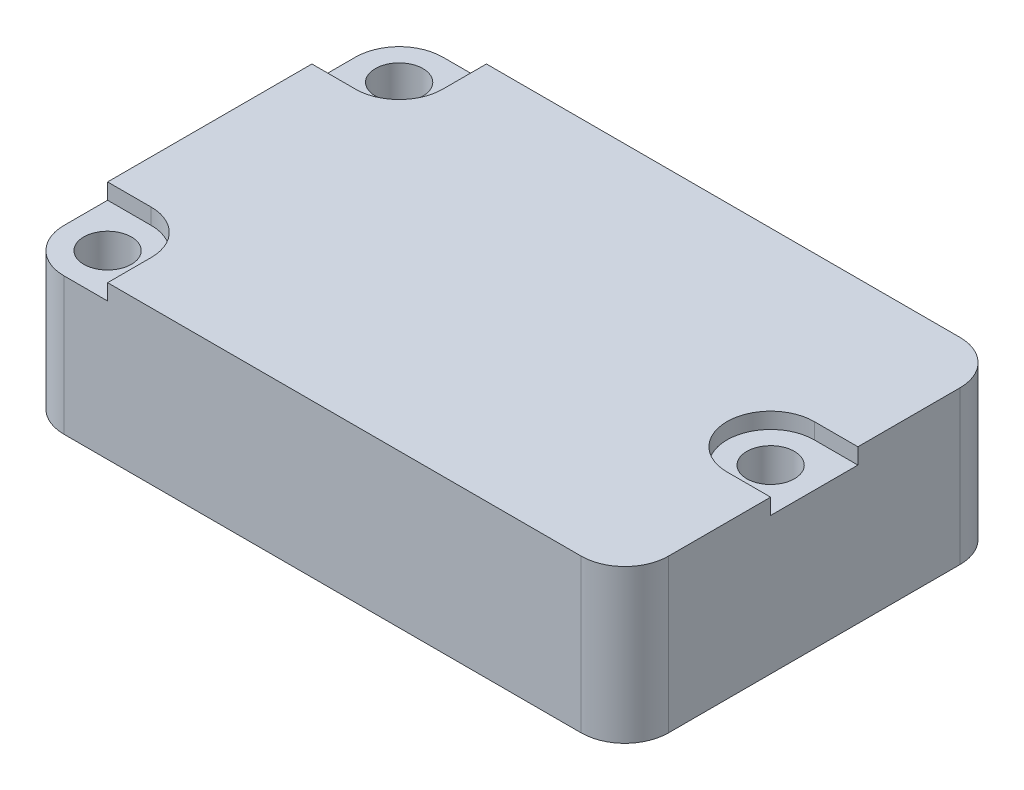
ISO-10303-21;
HEADER;
FILE_DESCRIPTION(('STEP AP214'),'2;1');
FILE_NAME('part.step','',(''),(''),'','','');
FILE_SCHEMA(('AUTOMOTIVE_DESIGN { 1 0 10303 214 1 1 1 1 }'));
ENDSEC;
DATA;
#1=APPLICATION_CONTEXT('core data for automotive mechanical design processes');
#2=APPLICATION_PROTOCOL_DEFINITION('international standard','automotive_design',2000,#1);
#3=PRODUCT_CONTEXT('',#1,'mechanical');
#4=PRODUCT('Part','Part','',(#3));
#5=PRODUCT_RELATED_PRODUCT_CATEGORY('part','',(#4));
#6=PRODUCT_DEFINITION_FORMATION('','',#4);
#7=PRODUCT_DEFINITION_CONTEXT('part definition',#1,'design');
#8=PRODUCT_DEFINITION('design','',#6,#7);
#9=PRODUCT_DEFINITION_SHAPE('','',#8);
#10=(LENGTH_UNIT() NAMED_UNIT(*) SI_UNIT(.MILLI.,.METRE.));
#11=(NAMED_UNIT(*) PLANE_ANGLE_UNIT() SI_UNIT($,.RADIAN.));
#12=(NAMED_UNIT(*) SI_UNIT($,.STERADIAN.) SOLID_ANGLE_UNIT());
#13=UNCERTAINTY_MEASURE_WITH_UNIT(LENGTH_MEASURE(1.E-05),#10,'distance_accuracy_value','');
#14=(GEOMETRIC_REPRESENTATION_CONTEXT(3) GLOBAL_UNCERTAINTY_ASSIGNED_CONTEXT((#13)) GLOBAL_UNIT_ASSIGNED_CONTEXT((#10,
#11,#12)) REPRESENTATION_CONTEXT('',''));
#15=CARTESIAN_POINT('',(0.,0.,0.));
#16=DIRECTION('',(0.,0.,1.));
#17=DIRECTION('',(1.,0.,0.));
#18=AXIS2_PLACEMENT_3D('',#15,#16,#17);
#19=CARTESIAN_POINT('',(35.35,9.65,2.75));
#20=DIRECTION('',(0.,-1.,0.));
#21=DIRECTION('',(0.,0.,-1.));
#22=AXIS2_PLACEMENT_3D('',#19,#20,#21);
#23=PLANE('',#22);
#24=DIRECTION('',(0.,0.,1.));
#25=VECTOR('',#24,1.);
#26=CARTESIAN_POINT('',(0.,9.65,2.75000000000002));
#27=LINE('',#26,#25);
#28=CARTESIAN_POINT('',(0.,9.65,5.5));
#29=VERTEX_POINT('',#28);
#30=CARTESIAN_POINT('',(0.,9.65,18.376));
#31=VERTEX_POINT('',#30);
#32=EDGE_CURVE('E343',#29,#31,#27,.T.);
#33=ORIENTED_EDGE('',*,*,#32,.T.);
#34=DIRECTION('',(-1.,0.,0.));
#35=VECTOR('',#34,1.);
#36=CARTESIAN_POINT('',(0.,9.65,18.376));
#37=LINE('',#36,#35);
#38=CARTESIAN_POINT('',(2.75,9.65,18.376));
#39=VERTEX_POINT('',#38);
#40=EDGE_CURVE('E239',#39,#31,#37,.T.);
#41=ORIENTED_EDGE('',*,*,#40,.F.);
#42=CARTESIAN_POINT('',(2.75,9.65,21.126));
#43=DIRECTION('',(0.,1.,0.));
#44=DIRECTION('',(0.,0.,1.));
#45=AXIS2_PLACEMENT_3D('',#42,#43,#44);
#46=CIRCLE('',#45,2.75);
#47=CARTESIAN_POINT('',(5.5,9.65,21.126));
#48=VERTEX_POINT('',#47);
#49=EDGE_CURVE('E254',#48,#39,#46,.T.);
#50=ORIENTED_EDGE('',*,*,#49,.F.);
#51=DIRECTION('',(0.,0.,1.));
#52=VECTOR('',#51,1.);
#53=CARTESIAN_POINT('',(5.5,9.65,0.));
#54=LINE('',#53,#52);
#55=CARTESIAN_POINT('',(5.5,9.65,23.876));
#56=VERTEX_POINT('',#55);
#57=EDGE_CURVE('E251',#48,#56,#54,.T.);
#58=ORIENTED_EDGE('',*,*,#57,.T.);
#59=DIRECTION('',(1.,0.,0.));
#60=VECTOR('',#59,1.);
#61=CARTESIAN_POINT('',(2.75000000000002,9.65,23.876));
#62=LINE('',#61,#60);
#63=CARTESIAN_POINT('',(35.35,9.65,23.876));
#64=VERTEX_POINT('',#63);
#65=EDGE_CURVE('E346',#56,#64,#62,.T.);
#66=ORIENTED_EDGE('',*,*,#65,.T.);
#67=CARTESIAN_POINT('',(35.35,9.65,21.126));
#68=DIRECTION('',(0.,1.,0.));
#69=DIRECTION('',(0.,0.,1.));
#70=AXIS2_PLACEMENT_3D('',#67,#68,#69);
#71=CIRCLE('',#70,2.75);
#72=CARTESIAN_POINT('',(38.1,9.65,21.126));
#73=VERTEX_POINT('',#72);
#74=EDGE_CURVE('E348',#64,#73,#71,.T.);
#75=ORIENTED_EDGE('',*,*,#74,.T.);
#76=DIRECTION('',(0.,0.,-1.));
#77=VECTOR('',#76,1.);
#78=CARTESIAN_POINT('',(38.1,9.65,2.75000000000002));
#79=LINE('',#78,#77);
#80=CARTESIAN_POINT('',(38.1,9.65,14.688));
#81=VERTEX_POINT('',#80);
#82=EDGE_CURVE('E351',#73,#81,#79,.T.);
#83=ORIENTED_EDGE('',*,*,#82,.T.);
#84=DIRECTION('',(1.,0.,0.));
#85=VECTOR('',#84,1.);
#86=CARTESIAN_POINT('',(0.,9.65,14.688));
#87=LINE('',#86,#85);
#88=CARTESIAN_POINT('',(35.35,9.65,14.688));
#89=VERTEX_POINT('',#88);
#90=EDGE_CURVE('E311',#89,#81,#87,.T.);
#91=ORIENTED_EDGE('',*,*,#90,.F.);
#92=CARTESIAN_POINT('',(35.35,9.65,11.938));
#93=DIRECTION('',(0.,1.,0.));
#94=DIRECTION('',(0.,0.,1.));
#95=AXIS2_PLACEMENT_3D('',#92,#93,#94);
#96=CIRCLE('',#95,2.75);
#97=CARTESIAN_POINT('',(35.35,9.65,9.188));
#98=VERTEX_POINT('',#97);
#99=EDGE_CURVE('E231',#98,#89,#96,.T.);
#100=ORIENTED_EDGE('',*,*,#99,.F.);
#101=DIRECTION('',(1.,0.,0.));
#102=VECTOR('',#101,1.);
#103=CARTESIAN_POINT('',(0.,9.65,9.188));
#104=LINE('',#103,#102);
#105=CARTESIAN_POINT('',(38.1,9.65,9.188));
#106=VERTEX_POINT('',#105);
#107=EDGE_CURVE('E301',#98,#106,#104,.T.);
#108=ORIENTED_EDGE('',*,*,#107,.T.);
#109=CARTESIAN_POINT('',(38.1,9.65,2.75000000000002));
#110=VERTEX_POINT('',#109);
#111=EDGE_CURVE('E350',#106,#110,#79,.T.);
#112=ORIENTED_EDGE('',*,*,#111,.T.);
#113=CARTESIAN_POINT('',(35.35,9.65,2.75));
#114=DIRECTION('',(0.,1.,0.));
#115=DIRECTION('',(0.,0.,-1.));
#116=AXIS2_PLACEMENT_3D('',#113,#114,#115);
#117=CIRCLE('',#116,2.75);
#118=CARTESIAN_POINT('',(35.35,9.65,0.));
#119=VERTEX_POINT('',#118);
#120=EDGE_CURVE('E336',#110,#119,#117,.T.);
#121=ORIENTED_EDGE('',*,*,#120,.T.);
#122=DIRECTION('',(-1.,0.,0.));
#123=VECTOR('',#122,1.);
#124=CARTESIAN_POINT('',(2.75000000000002,9.65,0.));
#125=LINE('',#124,#123);
#126=CARTESIAN_POINT('',(5.5,9.65,0.));
#127=VERTEX_POINT('',#126);
#128=EDGE_CURVE('E339',#119,#127,#125,.T.);
#129=ORIENTED_EDGE('',*,*,#128,.T.);
#130=DIRECTION('',(0.,0.,-1.));
#131=VECTOR('',#130,1.);
#132=CARTESIAN_POINT('',(5.5,9.65,0.));
#133=LINE('',#132,#131);
#134=CARTESIAN_POINT('',(5.5,9.65,2.75));
#135=VERTEX_POINT('',#134);
#136=EDGE_CURVE('E285',#135,#127,#133,.T.);
#137=ORIENTED_EDGE('',*,*,#136,.F.);
#138=CARTESIAN_POINT('',(2.75,9.65,2.75));
#139=DIRECTION('',(0.,1.,0.));
#140=DIRECTION('',(0.,0.,1.));
#141=AXIS2_PLACEMENT_3D('',#138,#139,#140);
#142=CIRCLE('',#141,2.75);
#143=CARTESIAN_POINT('',(2.75,9.65,5.5));
#144=VERTEX_POINT('',#143);
#145=EDGE_CURVE('E282',#144,#135,#142,.T.);
#146=ORIENTED_EDGE('',*,*,#145,.F.);
#147=DIRECTION('',(-1.,0.,0.));
#148=VECTOR('',#147,1.);
#149=CARTESIAN_POINT('',(0.,9.65,5.5));
#150=LINE('',#149,#148);
#151=EDGE_CURVE('E272',#144,#29,#150,.T.);
#152=ORIENTED_EDGE('',*,*,#151,.T.);
#153=EDGE_LOOP('',(#33,#41,#50,#58,#66,#75,#83,#91,#100,#108,#112,#121,#129,#137,#146,#152));
#154=FACE_BOUND('',#153,.T.);
#155=ADVANCED_FACE('F36',(#154),#23,.F.);
#156=CARTESIAN_POINT('',(2.75,9.65,2.75));
#157=DIRECTION('',(0.,-1.,0.));
#158=DIRECTION('',(0.,0.,-1.));
#159=AXIS2_PLACEMENT_3D('',#156,#157,#158);
#160=CYLINDRICAL_SURFACE('',#159,2.75);
#161=CARTESIAN_POINT('',(2.75,8.65,2.75));
#162=DIRECTION('',(0.,1.,0.));
#163=DIRECTION('',(0.,0.,1.));
#164=AXIS2_PLACEMENT_3D('',#161,#162,#163);
#165=CIRCLE('',#164,2.75);
#166=CARTESIAN_POINT('',(2.75,8.65,0.));
#167=VERTEX_POINT('',#166);
#168=CARTESIAN_POINT('',(0.,8.65,2.75000000000002));
#169=VERTEX_POINT('',#168);
#170=EDGE_CURVE('E61',#167,#169,#165,.T.);
#171=ORIENTED_EDGE('',*,*,#170,.F.);
#172=DIRECTION('',(0.,-1.,0.));
#173=VECTOR('',#172,1.);
#174=CARTESIAN_POINT('',(2.75000000000002,9.65,0.));
#175=LINE('',#174,#173);
#176=CARTESIAN_POINT('',(2.75000000000002,0.,0.));
#177=VERTEX_POINT('',#176);
#178=EDGE_CURVE('E45',#167,#177,#175,.T.);
#179=ORIENTED_EDGE('',*,*,#178,.T.);
#180=CARTESIAN_POINT('',(2.75,0.,2.75));
#181=DIRECTION('',(0.,1.,0.));
#182=DIRECTION('',(0.,0.,1.));
#183=AXIS2_PLACEMENT_3D('',#180,#181,#182);
#184=CIRCLE('',#183,2.75);
#185=CARTESIAN_POINT('',(0.,0.,2.75000000000002));
#186=VERTEX_POINT('',#185);
#187=EDGE_CURVE('E360',#177,#186,#184,.T.);
#188=ORIENTED_EDGE('',*,*,#187,.T.);
#189=DIRECTION('',(0.,-1.,0.));
#190=VECTOR('',#189,1.);
#191=CARTESIAN_POINT('',(0.,9.65,2.75000000000002));
#192=LINE('',#191,#190);
#193=EDGE_CURVE('E388',#169,#186,#192,.T.);
#194=ORIENTED_EDGE('',*,*,#193,.F.);
#195=EDGE_LOOP('',(#171,#179,#188,#194));
#196=FACE_BOUND('',#195,.T.);
#197=ADVANCED_FACE('F418',(#196),#160,.T.);
#198=CARTESIAN_POINT('',(0.,9.65,2.75000000000002));
#199=DIRECTION('',(1.,0.,0.));
#200=DIRECTION('',(0.,0.,-1.));
#201=AXIS2_PLACEMENT_3D('',#198,#199,#200);
#202=PLANE('',#201);
#203=DIRECTION('',(0.,0.,-1.));
#204=VECTOR('',#203,1.);
#205=CARTESIAN_POINT('',(0.,8.,5.5));
#206=LINE('',#205,#204);
#207=CARTESIAN_POINT('',(0.,8.,18.376));
#208=VERTEX_POINT('',#207);
#209=CARTESIAN_POINT('',(0.,8.,5.5));
#210=VERTEX_POINT('',#209);
#211=EDGE_CURVE('E222',#208,#210,#206,.T.);
#212=ORIENTED_EDGE('',*,*,#211,.F.);
#213=DIRECTION('',(0.,1.,0.));
#214=VECTOR('',#213,1.);
#215=CARTESIAN_POINT('',(0.,8.,18.376));
#216=LINE('',#215,#214);
#217=CARTESIAN_POINT('',(0.,0.,18.376));
#218=VERTEX_POINT('',#217);
#219=EDGE_CURVE('E207',#218,#208,#216,.T.);
#220=ORIENTED_EDGE('',*,*,#219,.F.);
#221=DIRECTION('',(0.,0.,1.));
#222=VECTOR('',#221,1.);
#223=CARTESIAN_POINT('',(0.,0.,2.75000000000002));
#224=LINE('',#223,#222);
#225=CARTESIAN_POINT('',(0.,0.,21.126));
#226=VERTEX_POINT('',#225);
#227=EDGE_CURVE('E363',#218,#226,#224,.T.);
#228=ORIENTED_EDGE('',*,*,#227,.T.);
#229=DIRECTION('',(0.,-1.,0.));
#230=VECTOR('',#229,1.);
#231=CARTESIAN_POINT('',(0.,9.65,21.126));
#232=LINE('',#231,#230);
#233=CARTESIAN_POINT('',(0.,8.65,21.126));
#234=VERTEX_POINT('',#233);
#235=EDGE_CURVE('E385',#234,#226,#232,.T.);
#236=ORIENTED_EDGE('',*,*,#235,.F.);
#237=DIRECTION('',(0.,0.,1.));
#238=VECTOR('',#237,1.);
#239=CARTESIAN_POINT('',(0.,8.65,0.));
#240=LINE('',#239,#238);
#241=CARTESIAN_POINT('',(0.,8.65,18.376));
#242=VERTEX_POINT('',#241);
#243=EDGE_CURVE('E236',#242,#234,#240,.T.);
#244=ORIENTED_EDGE('',*,*,#243,.F.);
#245=DIRECTION('',(0.,1.,0.));
#246=VECTOR('',#245,1.);
#247=CARTESIAN_POINT('',(0.,8.65,18.376));
#248=LINE('',#247,#246);
#249=EDGE_CURVE('E259',#242,#31,#248,.T.);
#250=ORIENTED_EDGE('',*,*,#249,.T.);
#251=ORIENTED_EDGE('',*,*,#32,.F.);
#252=DIRECTION('',(0.,1.,0.));
#253=VECTOR('',#252,1.);
#254=CARTESIAN_POINT('',(0.,8.65,5.5));
#255=LINE('',#254,#253);
#256=CARTESIAN_POINT('',(0.,8.65,5.5));
#257=VERTEX_POINT('',#256);
#258=EDGE_CURVE('E291',#257,#29,#255,.T.);
#259=ORIENTED_EDGE('',*,*,#258,.F.);
#260=DIRECTION('',(0.,0.,-1.));
#261=VECTOR('',#260,1.);
#262=CARTESIAN_POINT('',(0.,8.65,0.));
#263=LINE('',#262,#261);
#264=EDGE_CURVE('E277',#257,#169,#263,.T.);
#265=ORIENTED_EDGE('',*,*,#264,.T.);
#266=ORIENTED_EDGE('',*,*,#193,.T.);
#267=CARTESIAN_POINT('',(0.,0.,5.5));
#268=VERTEX_POINT('',#267);
#269=EDGE_CURVE('E364',#186,#268,#224,.T.);
#270=ORIENTED_EDGE('',*,*,#269,.T.);
#271=DIRECTION('',(0.,-1.,0.));
#272=VECTOR('',#271,1.);
#273=CARTESIAN_POINT('',(0.,8.,5.5));
#274=LINE('',#273,#272);
#275=EDGE_CURVE('E220',#210,#268,#274,.T.);
#276=ORIENTED_EDGE('',*,*,#275,.F.);
#277=EDGE_LOOP('',(#212,#220,#228,#236,#244,#250,#251,#259,#265,#266,#270,#276));
#278=FACE_BOUND('',#277,.T.);
#279=ADVANCED_FACE('F424',(#278),#202,.F.);
#280=CARTESIAN_POINT('',(2.75,9.65,21.126));
#281=DIRECTION('',(0.,-1.,0.));
#282=DIRECTION('',(0.,0.,-1.));
#283=AXIS2_PLACEMENT_3D('',#280,#281,#282);
#284=CYLINDRICAL_SURFACE('',#283,2.75);
#285=CARTESIAN_POINT('',(2.75,8.65,21.126));
#286=DIRECTION('',(0.,1.,0.));
#287=DIRECTION('',(0.,0.,1.));
#288=AXIS2_PLACEMENT_3D('',#285,#286,#287);
#289=CIRCLE('',#288,2.75);
#290=CARTESIAN_POINT('',(2.75,8.65,23.876));
#291=VERTEX_POINT('',#290);
#292=EDGE_CURVE('E322',#234,#291,#289,.T.);
#293=ORIENTED_EDGE('',*,*,#292,.F.);
#294=ORIENTED_EDGE('',*,*,#235,.T.);
#295=CARTESIAN_POINT('',(2.75,0.,21.126));
#296=DIRECTION('',(0.,1.,0.));
#297=DIRECTION('',(0.,0.,1.));
#298=AXIS2_PLACEMENT_3D('',#295,#296,#297);
#299=CIRCLE('',#298,2.75);
#300=CARTESIAN_POINT('',(2.75,0.,23.876));
#301=VERTEX_POINT('',#300);
#302=EDGE_CURVE('E367',#226,#301,#299,.T.);
#303=ORIENTED_EDGE('',*,*,#302,.T.);
#304=DIRECTION('',(0.,-1.,0.));
#305=VECTOR('',#304,1.);
#306=CARTESIAN_POINT('',(2.75,9.65,23.876));
#307=LINE('',#306,#305);
#308=EDGE_CURVE('E383',#291,#301,#307,.T.);
#309=ORIENTED_EDGE('',*,*,#308,.F.);
#310=EDGE_LOOP('',(#293,#294,#303,#309));
#311=FACE_BOUND('',#310,.T.);
#312=ADVANCED_FACE('F448',(#311),#284,.T.);
#313=CARTESIAN_POINT('',(2.75000000000002,9.65,23.876));
#314=DIRECTION('',(0.,0.,-1.));
#315=DIRECTION('',(-1.,0.,0.));
#316=AXIS2_PLACEMENT_3D('',#313,#314,#315);
#317=PLANE('',#316);
#318=DIRECTION('',(0.,1.,0.));
#319=VECTOR('',#318,1.);
#320=CARTESIAN_POINT('',(5.5,8.65,23.876));
#321=LINE('',#320,#319);
#322=CARTESIAN_POINT('',(5.5,8.65,23.876));
#323=VERTEX_POINT('',#322);
#324=EDGE_CURVE('E250',#323,#56,#321,.T.);
#325=ORIENTED_EDGE('',*,*,#324,.F.);
#326=DIRECTION('',(-1.,0.,0.));
#327=VECTOR('',#326,1.);
#328=CARTESIAN_POINT('',(0.,8.65,23.876));
#329=LINE('',#328,#327);
#330=EDGE_CURVE('E238',#323,#291,#329,.T.);
#331=ORIENTED_EDGE('',*,*,#330,.T.);
#332=ORIENTED_EDGE('',*,*,#308,.T.);
#333=DIRECTION('',(1.,0.,0.));
#334=VECTOR('',#333,1.);
#335=CARTESIAN_POINT('',(2.75000000000002,0.,23.876));
#336=LINE('',#335,#334);
#337=CARTESIAN_POINT('',(35.35,0.,23.876));
#338=VERTEX_POINT('',#337);
#339=EDGE_CURVE('E370',#301,#338,#336,.T.);
#340=ORIENTED_EDGE('',*,*,#339,.T.);
#341=DIRECTION('',(0.,-1.,0.));
#342=VECTOR('',#341,1.);
#343=CARTESIAN_POINT('',(35.35,9.65,23.876));
#344=LINE('',#343,#342);
#345=EDGE_CURVE('E380',#64,#338,#344,.T.);
#346=ORIENTED_EDGE('',*,*,#345,.F.);
#347=ORIENTED_EDGE('',*,*,#65,.F.);
#348=EDGE_LOOP('',(#325,#331,#332,#340,#346,#347));
#349=FACE_BOUND('',#348,.T.);
#350=ADVANCED_FACE('F438',(#349),#317,.F.);
#351=CARTESIAN_POINT('',(38.1,9.65,2.75000000000002));
#352=DIRECTION('',(-1.,0.,0.));
#353=DIRECTION('',(0.,0.,1.));
#354=AXIS2_PLACEMENT_3D('',#351,#352,#353);
#355=PLANE('',#354);
#356=DIRECTION('',(0.,1.,0.));
#357=VECTOR('',#356,1.);
#358=CARTESIAN_POINT('',(38.1,8.65,9.188));
#359=LINE('',#358,#357);
#360=CARTESIAN_POINT('',(38.1,8.65,9.188));
#361=VERTEX_POINT('',#360);
#362=EDGE_CURVE('E316',#361,#106,#359,.T.);
#363=ORIENTED_EDGE('',*,*,#362,.F.);
#364=DIRECTION('',(0.,0.,-1.));
#365=VECTOR('',#364,1.);
#366=CARTESIAN_POINT('',(38.1,8.65,0.));
#367=LINE('',#366,#365);
#368=CARTESIAN_POINT('',(38.1,8.65,14.688));
#369=VERTEX_POINT('',#368);
#370=EDGE_CURVE('E303',#369,#361,#367,.T.);
#371=ORIENTED_EDGE('',*,*,#370,.F.);
#372=DIRECTION('',(0.,1.,0.));
#373=VECTOR('',#372,1.);
#374=CARTESIAN_POINT('',(38.1,8.65,14.688));
#375=LINE('',#374,#373);
#376=EDGE_CURVE('E318',#369,#81,#375,.T.);
#377=ORIENTED_EDGE('',*,*,#376,.T.);
#378=ORIENTED_EDGE('',*,*,#82,.F.);
#379=DIRECTION('',(0.,-1.,0.));
#380=VECTOR('',#379,1.);
#381=CARTESIAN_POINT('',(38.1,9.65,21.126));
#382=LINE('',#381,#380);
#383=CARTESIAN_POINT('',(38.1,0.,21.126));
#384=VERTEX_POINT('',#383);
#385=EDGE_CURVE('E377',#73,#384,#382,.T.);
#386=ORIENTED_EDGE('',*,*,#385,.T.);
#387=DIRECTION('',(0.,0.,-1.));
#388=VECTOR('',#387,1.);
#389=CARTESIAN_POINT('',(38.1,0.,2.75000000000002));
#390=LINE('',#389,#388);
#391=CARTESIAN_POINT('',(38.1,0.,2.75000000000002));
#392=VERTEX_POINT('',#391);
#393=EDGE_CURVE('E340',#384,#392,#390,.T.);
#394=ORIENTED_EDGE('',*,*,#393,.T.);
#395=DIRECTION('',(0.,-1.,0.));
#396=VECTOR('',#395,1.);
#397=CARTESIAN_POINT('',(38.1,9.65,2.75000000000002));
#398=LINE('',#397,#396);
#399=EDGE_CURVE('E354',#110,#392,#398,.T.);
#400=ORIENTED_EDGE('',*,*,#399,.F.);
#401=ORIENTED_EDGE('',*,*,#111,.F.);
#402=EDGE_LOOP('',(#363,#371,#377,#378,#386,#394,#400,#401));
#403=FACE_BOUND('',#402,.T.);
#404=ADVANCED_FACE('F435',(#403),#355,.F.);
#405=CARTESIAN_POINT('',(2.75,9.65,2.75));
#406=DIRECTION('',(0.,-1.,0.));
#407=DIRECTION('',(0.,0.,-1.));
#408=AXIS2_PLACEMENT_3D('',#405,#406,#407);
#409=CYLINDRICAL_SURFACE('',#408,1.5);
#410=CARTESIAN_POINT('',(2.75,0.,2.75));
#411=DIRECTION('',(0.,1.,0.));
#412=DIRECTION('',(0.,0.,1.));
#413=AXIS2_PLACEMENT_3D('',#410,#411,#412);
#414=CIRCLE('',#413,1.5);
#415=CARTESIAN_POINT('',(2.75,0.,4.25));
#416=VERTEX_POINT('',#415);
#417=EDGE_CURVE('E332',#416,#416,#414,.T.);
#418=ORIENTED_EDGE('',*,*,#417,.F.);
#419=EDGE_LOOP('',(#418));
#420=FACE_BOUND('',#419,.T.);
#421=CARTESIAN_POINT('',(2.75,8.65,2.75));
#422=DIRECTION('',(0.,1.,0.));
#423=DIRECTION('',(0.,0.,1.));
#424=AXIS2_PLACEMENT_3D('',#421,#422,#423);
#425=CIRCLE('',#424,1.5);
#426=CARTESIAN_POINT('',(2.75,8.65,4.25));
#427=VERTEX_POINT('',#426);
#428=EDGE_CURVE('E40',#427,#427,#425,.T.);
#429=ORIENTED_EDGE('',*,*,#428,.T.);
#430=EDGE_LOOP('',(#429));
#431=FACE_BOUND('',#430,.T.);
#432=ADVANCED_FACE('F398',(#420,#431),#409,.F.);
#433=CARTESIAN_POINT('',(35.35,9.65,11.938));
#434=DIRECTION('',(0.,-1.,0.));
#435=DIRECTION('',(0.,0.,-1.));
#436=AXIS2_PLACEMENT_3D('',#433,#434,#435);
#437=CYLINDRICAL_SURFACE('',#436,1.5);
#438=CARTESIAN_POINT('',(35.35,0.,11.938));
#439=DIRECTION('',(0.,1.,0.));
#440=DIRECTION('',(0.,0.,1.));
#441=AXIS2_PLACEMENT_3D('',#438,#439,#440);
#442=CIRCLE('',#441,1.5);
#443=CARTESIAN_POINT('',(35.35,0.,13.438));
#444=VERTEX_POINT('',#443);
#445=EDGE_CURVE('E329',#444,#444,#442,.T.);
#446=ORIENTED_EDGE('',*,*,#445,.F.);
#447=EDGE_LOOP('',(#446));
#448=FACE_BOUND('',#447,.T.);
#449=CARTESIAN_POINT('',(35.35,8.65,11.938));
#450=DIRECTION('',(0.,1.,0.));
#451=DIRECTION('',(0.,0.,1.));
#452=AXIS2_PLACEMENT_3D('',#449,#450,#451);
#453=CIRCLE('',#452,1.5);
#454=CARTESIAN_POINT('',(35.35,8.65,13.438));
#455=VERTEX_POINT('',#454);
#456=EDGE_CURVE('E324',#455,#455,#453,.T.);
#457=ORIENTED_EDGE('',*,*,#456,.T.);
#458=EDGE_LOOP('',(#457));
#459=FACE_BOUND('',#458,.T.);
#460=ADVANCED_FACE('F522',(#448,#459),#437,.F.);
#461=CARTESIAN_POINT('',(2.75,9.65,21.126));
#462=DIRECTION('',(0.,-1.,0.));
#463=DIRECTION('',(0.,0.,-1.));
#464=AXIS2_PLACEMENT_3D('',#461,#462,#463);
#465=CYLINDRICAL_SURFACE('',#464,1.5);
#466=CARTESIAN_POINT('',(2.75,0.,21.126));
#467=DIRECTION('',(0.,1.,0.));
#468=DIRECTION('',(0.,0.,1.));
#469=AXIS2_PLACEMENT_3D('',#466,#467,#468);
#470=CIRCLE('',#469,1.5);
#471=CARTESIAN_POINT('',(2.75,0.,22.626));
#472=VERTEX_POINT('',#471);
#473=EDGE_CURVE('E326',#472,#472,#470,.T.);
#474=ORIENTED_EDGE('',*,*,#473,.F.);
#475=EDGE_LOOP('',(#474));
#476=FACE_BOUND('',#475,.T.);
#477=CARTESIAN_POINT('',(2.75,8.65,21.126));
#478=DIRECTION('',(0.,1.,0.));
#479=DIRECTION('',(0.,0.,1.));
#480=AXIS2_PLACEMENT_3D('',#477,#478,#479);
#481=CIRCLE('',#480,1.5);
#482=CARTESIAN_POINT('',(2.75,8.65,22.626));
#483=VERTEX_POINT('',#482);
#484=EDGE_CURVE('E262',#483,#483,#481,.T.);
#485=ORIENTED_EDGE('',*,*,#484,.T.);
#486=EDGE_LOOP('',(#485));
#487=FACE_BOUND('',#486,.T.);
#488=ADVANCED_FACE('F433',(#476,#487),#465,.F.);
#489=CARTESIAN_POINT('',(35.35,0.,2.75));
#490=DIRECTION('',(0.,-1.,0.));
#491=DIRECTION('',(0.,0.,-1.));
#492=AXIS2_PLACEMENT_3D('',#489,#490,#491);
#493=PLANE('',#492);
#494=DIRECTION('',(-1.,0.,0.));
#495=VECTOR('',#494,1.);
#496=CARTESIAN_POINT('',(3.,0.,18.376));
#497=LINE('',#496,#495);
#498=CARTESIAN_POINT('',(3.,0.,18.376));
#499=VERTEX_POINT('',#498);
#500=EDGE_CURVE('E229',#499,#218,#497,.T.);
#501=ORIENTED_EDGE('',*,*,#500,.F.);
#502=DIRECTION('',(0.,0.,1.));
#503=VECTOR('',#502,1.);
#504=CARTESIAN_POINT('',(3.,0.,5.5));
#505=LINE('',#504,#503);
#506=CARTESIAN_POINT('',(3.,0.,5.5));
#507=VERTEX_POINT('',#506);
#508=EDGE_CURVE('E212',#507,#499,#505,.T.);
#509=ORIENTED_EDGE('',*,*,#508,.F.);
#510=DIRECTION('',(-1.,0.,0.));
#511=VECTOR('',#510,1.);
#512=CARTESIAN_POINT('',(3.,0.,5.5));
#513=LINE('',#512,#511);
#514=EDGE_CURVE('E232',#507,#268,#513,.T.);
#515=ORIENTED_EDGE('',*,*,#514,.T.);
#516=ORIENTED_EDGE('',*,*,#269,.F.);
#517=ORIENTED_EDGE('',*,*,#187,.F.);
#518=DIRECTION('',(-1.,0.,0.));
#519=VECTOR('',#518,1.);
#520=CARTESIAN_POINT('',(2.75000000000002,0.,0.));
#521=LINE('',#520,#519);
#522=CARTESIAN_POINT('',(35.35,0.,0.));
#523=VERTEX_POINT('',#522);
#524=EDGE_CURVE('E357',#523,#177,#521,.T.);
#525=ORIENTED_EDGE('',*,*,#524,.F.);
#526=CARTESIAN_POINT('',(35.35,0.,2.75));
#527=DIRECTION('',(0.,1.,0.));
#528=DIRECTION('',(0.,0.,-1.));
#529=AXIS2_PLACEMENT_3D('',#526,#527,#528);
#530=CIRCLE('',#529,2.75);
#531=EDGE_CURVE('E335',#392,#523,#530,.T.);
#532=ORIENTED_EDGE('',*,*,#531,.F.);
#533=ORIENTED_EDGE('',*,*,#393,.F.);
#534=CARTESIAN_POINT('',(35.35,0.,21.126));
#535=DIRECTION('',(0.,1.,0.));
#536=DIRECTION('',(0.,0.,1.));
#537=AXIS2_PLACEMENT_3D('',#534,#535,#536);
#538=CIRCLE('',#537,2.75);
#539=EDGE_CURVE('E372',#338,#384,#538,.T.);
#540=ORIENTED_EDGE('',*,*,#539,.F.);
#541=ORIENTED_EDGE('',*,*,#339,.F.);
#542=ORIENTED_EDGE('',*,*,#302,.F.);
#543=ORIENTED_EDGE('',*,*,#227,.F.);
#544=EDGE_LOOP('',(#501,#509,#515,#516,#517,#525,#532,#533,#540,#541,#542,#543));
#545=FACE_BOUND('',#544,.T.);
#546=ORIENTED_EDGE('',*,*,#445,.T.);
#547=EDGE_LOOP('',(#546));
#548=FACE_BOUND('',#547,.T.);
#549=ORIENTED_EDGE('',*,*,#417,.T.);
#550=EDGE_LOOP('',(#549));
#551=FACE_BOUND('',#550,.T.);
#552=ORIENTED_EDGE('',*,*,#473,.T.);
#553=EDGE_LOOP('',(#552));
#554=FACE_BOUND('',#553,.T.);
#555=ADVANCED_FACE('F430',(#545,#548,#551,#554),#493,.T.);
#556=CARTESIAN_POINT('',(35.35,9.65,2.75));
#557=DIRECTION('',(0.,-1.,0.));
#558=DIRECTION('',(0.,0.,-1.));
#559=AXIS2_PLACEMENT_3D('',#556,#557,#558);
#560=CYLINDRICAL_SURFACE('',#559,2.75);
#561=ORIENTED_EDGE('',*,*,#531,.T.);
#562=DIRECTION('',(0.,-1.,0.));
#563=VECTOR('',#562,1.);
#564=CARTESIAN_POINT('',(35.35,9.65,0.));
#565=LINE('',#564,#563);
#566=EDGE_CURVE('E11',#119,#523,#565,.T.);
#567=ORIENTED_EDGE('',*,*,#566,.F.);
#568=ORIENTED_EDGE('',*,*,#120,.F.);
#569=ORIENTED_EDGE('',*,*,#399,.T.);
#570=EDGE_LOOP('',(#561,#567,#568,#569));
#571=FACE_BOUND('',#570,.T.);
#572=ADVANCED_FACE('F38',(#571),#560,.T.);
#573=CARTESIAN_POINT('',(2.75000000000002,9.65,0.));
#574=DIRECTION('',(0.,0.,1.));
#575=DIRECTION('',(1.,0.,0.));
#576=AXIS2_PLACEMENT_3D('',#573,#574,#575);
#577=PLANE('',#576);
#578=DIRECTION('',(-1.,0.,0.));
#579=VECTOR('',#578,1.);
#580=CARTESIAN_POINT('',(0.,8.65,0.));
#581=LINE('',#580,#579);
#582=CARTESIAN_POINT('',(5.5,8.65,0.));
#583=VERTEX_POINT('',#582);
#584=EDGE_CURVE('E275',#583,#167,#581,.T.);
#585=ORIENTED_EDGE('',*,*,#584,.F.);
#586=DIRECTION('',(0.,1.,0.));
#587=VECTOR('',#586,1.);
#588=CARTESIAN_POINT('',(5.5,8.65,0.));
#589=LINE('',#588,#587);
#590=EDGE_CURVE('E293',#583,#127,#589,.T.);
#591=ORIENTED_EDGE('',*,*,#590,.T.);
#592=ORIENTED_EDGE('',*,*,#128,.F.);
#593=ORIENTED_EDGE('',*,*,#566,.T.);
#594=ORIENTED_EDGE('',*,*,#524,.T.);
#595=ORIENTED_EDGE('',*,*,#178,.F.);
#596=EDGE_LOOP('',(#585,#591,#592,#593,#594,#595));
#597=FACE_BOUND('',#596,.T.);
#598=ADVANCED_FACE('F444',(#597),#577,.F.);
#599=CARTESIAN_POINT('',(35.35,9.65,21.126));
#600=DIRECTION('',(0.,-1.,0.));
#601=DIRECTION('',(0.,0.,-1.));
#602=AXIS2_PLACEMENT_3D('',#599,#600,#601);
#603=CYLINDRICAL_SURFACE('',#602,2.75);
#604=ORIENTED_EDGE('',*,*,#539,.T.);
#605=ORIENTED_EDGE('',*,*,#385,.F.);
#606=ORIENTED_EDGE('',*,*,#74,.F.);
#607=ORIENTED_EDGE('',*,*,#345,.T.);
#608=EDGE_LOOP('',(#604,#605,#606,#607));
#609=FACE_BOUND('',#608,.T.);
#610=ADVANCED_FACE('F440',(#609),#603,.T.);
#611=CARTESIAN_POINT('',(0.,8.65,0.));
#612=DIRECTION('',(0.,1.,0.));
#613=DIRECTION('',(0.,0.,1.));
#614=AXIS2_PLACEMENT_3D('',#611,#612,#613);
#615=PLANE('',#614);
#616=ORIENTED_EDGE('',*,*,#484,.F.);
#617=EDGE_LOOP('',(#616));
#618=FACE_BOUND('',#617,.T.);
#619=ORIENTED_EDGE('',*,*,#292,.T.);
#620=ORIENTED_EDGE('',*,*,#330,.F.);
#621=DIRECTION('',(0.,0.,1.));
#622=VECTOR('',#621,1.);
#623=CARTESIAN_POINT('',(5.5,8.65,0.));
#624=LINE('',#623,#622);
#625=CARTESIAN_POINT('',(5.5,8.65,21.126));
#626=VERTEX_POINT('',#625);
#627=EDGE_CURVE('E242',#626,#323,#624,.T.);
#628=ORIENTED_EDGE('',*,*,#627,.F.);
#629=CARTESIAN_POINT('',(2.75,8.65,21.126));
#630=DIRECTION('',(0.,1.,0.));
#631=DIRECTION('',(0.,0.,1.));
#632=AXIS2_PLACEMENT_3D('',#629,#630,#631);
#633=CIRCLE('',#632,2.75);
#634=CARTESIAN_POINT('',(2.75,8.65,18.376));
#635=VERTEX_POINT('',#634);
#636=EDGE_CURVE('E244',#626,#635,#633,.T.);
#637=ORIENTED_EDGE('',*,*,#636,.T.);
#638=DIRECTION('',(-1.,0.,0.));
#639=VECTOR('',#638,1.);
#640=CARTESIAN_POINT('',(0.,8.65,18.376));
#641=LINE('',#640,#639);
#642=EDGE_CURVE('E247',#635,#242,#641,.T.);
#643=ORIENTED_EDGE('',*,*,#642,.T.);
#644=ORIENTED_EDGE('',*,*,#243,.T.);
#645=EDGE_LOOP('',(#619,#620,#628,#637,#643,#644));
#646=FACE_BOUND('',#645,.T.);
#647=ADVANCED_FACE('F443',(#618,#646),#615,.T.);
#648=CARTESIAN_POINT('',(0.,8.65,18.376));
#649=DIRECTION('',(0.,0.,-1.));
#650=DIRECTION('',(-1.,0.,0.));
#651=AXIS2_PLACEMENT_3D('',#648,#649,#650);
#652=PLANE('',#651);
#653=ORIENTED_EDGE('',*,*,#40,.T.);
#654=ORIENTED_EDGE('',*,*,#249,.F.);
#655=ORIENTED_EDGE('',*,*,#642,.F.);
#656=DIRECTION('',(0.,1.,0.));
#657=VECTOR('',#656,1.);
#658=CARTESIAN_POINT('',(2.75,8.65,18.376));
#659=LINE('',#658,#657);
#660=EDGE_CURVE('E263',#635,#39,#659,.T.);
#661=ORIENTED_EDGE('',*,*,#660,.T.);
#662=EDGE_LOOP('',(#653,#654,#655,#661));
#663=FACE_BOUND('',#662,.T.);
#664=ADVANCED_FACE('F500',(#663),#652,.F.);
#665=CARTESIAN_POINT('',(2.75,8.65,21.126));
#666=DIRECTION('',(0.,1.,0.));
#667=DIRECTION('',(0.,0.,1.));
#668=AXIS2_PLACEMENT_3D('',#665,#666,#667);
#669=CYLINDRICAL_SURFACE('',#668,2.75);
#670=ORIENTED_EDGE('',*,*,#49,.T.);
#671=ORIENTED_EDGE('',*,*,#660,.F.);
#672=ORIENTED_EDGE('',*,*,#636,.F.);
#673=DIRECTION('',(0.,1.,0.));
#674=VECTOR('',#673,1.);
#675=CARTESIAN_POINT('',(5.5,8.65,21.126));
#676=LINE('',#675,#674);
#677=EDGE_CURVE('E265',#626,#48,#676,.T.);
#678=ORIENTED_EDGE('',*,*,#677,.T.);
#679=EDGE_LOOP('',(#670,#671,#672,#678));
#680=FACE_BOUND('',#679,.T.);
#681=ADVANCED_FACE('F543',(#680),#669,.F.);
#682=CARTESIAN_POINT('',(5.5,8.65,0.));
#683=DIRECTION('',(-1.,0.,0.));
#684=DIRECTION('',(0.,0.,1.));
#685=AXIS2_PLACEMENT_3D('',#682,#683,#684);
#686=PLANE('',#685);
#687=ORIENTED_EDGE('',*,*,#57,.F.);
#688=ORIENTED_EDGE('',*,*,#677,.F.);
#689=ORIENTED_EDGE('',*,*,#627,.T.);
#690=ORIENTED_EDGE('',*,*,#324,.T.);
#691=EDGE_LOOP('',(#687,#688,#689,#690));
#692=FACE_BOUND('',#691,.T.);
#693=ADVANCED_FACE('F519',(#692),#686,.T.);
#694=CARTESIAN_POINT('',(35.35,8.65,11.938));
#695=DIRECTION('',(0.,1.,0.));
#696=DIRECTION('',(0.,0.,1.));
#697=AXIS2_PLACEMENT_3D('',#694,#695,#696);
#698=CYLINDRICAL_SURFACE('',#697,2.75);
#699=ORIENTED_EDGE('',*,*,#99,.T.);
#700=DIRECTION('',(0.,1.,0.));
#701=VECTOR('',#700,1.);
#702=CARTESIAN_POINT('',(35.35,8.65,14.688));
#703=LINE('',#702,#701);
#704=CARTESIAN_POINT('',(35.35,8.65,14.688));
#705=VERTEX_POINT('',#704);
#706=EDGE_CURVE('E308',#705,#89,#703,.T.);
#707=ORIENTED_EDGE('',*,*,#706,.F.);
#708=CARTESIAN_POINT('',(35.35,8.65,11.938));
#709=DIRECTION('',(0.,1.,0.));
#710=DIRECTION('',(0.,0.,1.));
#711=AXIS2_PLACEMENT_3D('',#708,#709,#710);
#712=CIRCLE('',#711,2.75);
#713=CARTESIAN_POINT('',(35.35,8.65,9.188));
#714=VERTEX_POINT('',#713);
#715=EDGE_CURVE('E297',#714,#705,#712,.T.);
#716=ORIENTED_EDGE('',*,*,#715,.F.);
#717=DIRECTION('',(0.,1.,0.));
#718=VECTOR('',#717,1.);
#719=CARTESIAN_POINT('',(35.35,8.65,9.188));
#720=LINE('',#719,#718);
#721=EDGE_CURVE('E286',#714,#98,#720,.T.);
#722=ORIENTED_EDGE('',*,*,#721,.T.);
#723=EDGE_LOOP('',(#699,#707,#716,#722));
#724=FACE_BOUND('',#723,.T.);
#725=ADVANCED_FACE('F512',(#724),#698,.F.);
#726=CARTESIAN_POINT('',(0.,8.65,9.188));
#727=DIRECTION('',(0.,0.,1.));
#728=DIRECTION('',(1.,0.,0.));
#729=AXIS2_PLACEMENT_3D('',#726,#727,#728);
#730=PLANE('',#729);
#731=ORIENTED_EDGE('',*,*,#107,.F.);
#732=ORIENTED_EDGE('',*,*,#721,.F.);
#733=DIRECTION('',(1.,0.,0.));
#734=VECTOR('',#733,1.);
#735=CARTESIAN_POINT('',(0.,8.65,9.188));
#736=LINE('',#735,#734);
#737=EDGE_CURVE('E306',#714,#361,#736,.T.);
#738=ORIENTED_EDGE('',*,*,#737,.T.);
#739=ORIENTED_EDGE('',*,*,#362,.T.);
#740=EDGE_LOOP('',(#731,#732,#738,#739));
#741=FACE_BOUND('',#740,.T.);
#742=ADVANCED_FACE('F509',(#741),#730,.T.);
#743=CARTESIAN_POINT('',(0.,8.65,14.688));
#744=DIRECTION('',(0.,0.,1.));
#745=DIRECTION('',(1.,0.,0.));
#746=AXIS2_PLACEMENT_3D('',#743,#744,#745);
#747=PLANE('',#746);
#748=ORIENTED_EDGE('',*,*,#90,.T.);
#749=ORIENTED_EDGE('',*,*,#376,.F.);
#750=DIRECTION('',(1.,0.,0.));
#751=VECTOR('',#750,1.);
#752=CARTESIAN_POINT('',(0.,8.65,14.688));
#753=LINE('',#752,#751);
#754=EDGE_CURVE('E300',#705,#369,#753,.T.);
#755=ORIENTED_EDGE('',*,*,#754,.F.);
#756=ORIENTED_EDGE('',*,*,#706,.T.);
#757=EDGE_LOOP('',(#748,#749,#755,#756));
#758=FACE_BOUND('',#757,.T.);
#759=ADVANCED_FACE('F412',(#758),#747,.F.);
#760=CARTESIAN_POINT('',(0.,8.65,0.));
#761=DIRECTION('',(0.,1.,0.));
#762=DIRECTION('',(0.,0.,1.));
#763=AXIS2_PLACEMENT_3D('',#760,#761,#762);
#764=PLANE('',#763);
#765=ORIENTED_EDGE('',*,*,#456,.F.);
#766=EDGE_LOOP('',(#765));
#767=FACE_BOUND('',#766,.T.);
#768=ORIENTED_EDGE('',*,*,#715,.T.);
#769=ORIENTED_EDGE('',*,*,#754,.T.);
#770=ORIENTED_EDGE('',*,*,#370,.T.);
#771=ORIENTED_EDGE('',*,*,#737,.F.);
#772=EDGE_LOOP('',(#768,#769,#770,#771));
#773=FACE_BOUND('',#772,.T.);
#774=ADVANCED_FACE('F403',(#767,#773),#764,.T.);
#775=CARTESIAN_POINT('',(0.,8.65,0.));
#776=DIRECTION('',(0.,1.,0.));
#777=DIRECTION('',(0.,0.,1.));
#778=AXIS2_PLACEMENT_3D('',#775,#776,#777);
#779=PLANE('',#778);
#780=ORIENTED_EDGE('',*,*,#428,.F.);
#781=EDGE_LOOP('',(#780));
#782=FACE_BOUND('',#781,.T.);
#783=ORIENTED_EDGE('',*,*,#170,.T.);
#784=ORIENTED_EDGE('',*,*,#264,.F.);
#785=DIRECTION('',(-1.,0.,0.));
#786=VECTOR('',#785,1.);
#787=CARTESIAN_POINT('',(0.,8.65,5.5));
#788=LINE('',#787,#786);
#789=CARTESIAN_POINT('',(2.75,8.65,5.5));
#790=VERTEX_POINT('',#789);
#791=EDGE_CURVE('E279',#790,#257,#788,.T.);
#792=ORIENTED_EDGE('',*,*,#791,.F.);
#793=CARTESIAN_POINT('',(2.75,8.65,2.75));
#794=DIRECTION('',(0.,1.,0.));
#795=DIRECTION('',(0.,0.,1.));
#796=AXIS2_PLACEMENT_3D('',#793,#794,#795);
#797=CIRCLE('',#796,2.75);
#798=CARTESIAN_POINT('',(5.5,8.65,2.75));
#799=VERTEX_POINT('',#798);
#800=EDGE_CURVE('E268',#790,#799,#797,.T.);
#801=ORIENTED_EDGE('',*,*,#800,.T.);
#802=DIRECTION('',(0.,0.,-1.));
#803=VECTOR('',#802,1.);
#804=CARTESIAN_POINT('',(5.5,8.65,0.));
#805=LINE('',#804,#803);
#806=EDGE_CURVE('E271',#799,#583,#805,.T.);
#807=ORIENTED_EDGE('',*,*,#806,.T.);
#808=ORIENTED_EDGE('',*,*,#584,.T.);
#809=EDGE_LOOP('',(#783,#784,#792,#801,#807,#808));
#810=FACE_BOUND('',#809,.T.);
#811=ADVANCED_FACE('F400',(#782,#810),#779,.T.);
#812=CARTESIAN_POINT('',(2.75,8.65,2.75));
#813=DIRECTION('',(0.,1.,0.));
#814=DIRECTION('',(0.,0.,1.));
#815=AXIS2_PLACEMENT_3D('',#812,#813,#814);
#816=CYLINDRICAL_SURFACE('',#815,2.75);
#817=ORIENTED_EDGE('',*,*,#145,.T.);
#818=DIRECTION('',(0.,1.,0.));
#819=VECTOR('',#818,1.);
#820=CARTESIAN_POINT('',(5.5,8.65,2.75));
#821=LINE('',#820,#819);
#822=EDGE_CURVE('E281',#799,#135,#821,.T.);
#823=ORIENTED_EDGE('',*,*,#822,.F.);
#824=ORIENTED_EDGE('',*,*,#800,.F.);
#825=DIRECTION('',(0.,1.,0.));
#826=VECTOR('',#825,1.);
#827=CARTESIAN_POINT('',(2.75,8.65,5.5));
#828=LINE('',#827,#826);
#829=EDGE_CURVE('E255',#790,#144,#828,.T.);
#830=ORIENTED_EDGE('',*,*,#829,.T.);
#831=EDGE_LOOP('',(#817,#823,#824,#830));
#832=FACE_BOUND('',#831,.T.);
#833=ADVANCED_FACE('F402',(#832),#816,.F.);
#834=CARTESIAN_POINT('',(0.,8.65,5.5));
#835=DIRECTION('',(0.,0.,-1.));
#836=DIRECTION('',(-1.,0.,0.));
#837=AXIS2_PLACEMENT_3D('',#834,#835,#836);
#838=PLANE('',#837);
#839=ORIENTED_EDGE('',*,*,#151,.F.);
#840=ORIENTED_EDGE('',*,*,#829,.F.);
#841=ORIENTED_EDGE('',*,*,#791,.T.);
#842=ORIENTED_EDGE('',*,*,#258,.T.);
#843=EDGE_LOOP('',(#839,#840,#841,#842));
#844=FACE_BOUND('',#843,.T.);
#845=ADVANCED_FACE('F409',(#844),#838,.T.);
#846=CARTESIAN_POINT('',(5.5,8.65,0.));
#847=DIRECTION('',(1.,0.,0.));
#848=DIRECTION('',(0.,0.,-1.));
#849=AXIS2_PLACEMENT_3D('',#846,#847,#848);
#850=PLANE('',#849);
#851=ORIENTED_EDGE('',*,*,#136,.T.);
#852=ORIENTED_EDGE('',*,*,#590,.F.);
#853=ORIENTED_EDGE('',*,*,#806,.F.);
#854=ORIENTED_EDGE('',*,*,#822,.T.);
#855=EDGE_LOOP('',(#851,#852,#853,#854));
#856=FACE_BOUND('',#855,.T.);
#857=ADVANCED_FACE('F477',(#856),#850,.F.);
#858=CARTESIAN_POINT('',(3.,8.,18.376));
#859=DIRECTION('',(0.,0.,1.));
#860=DIRECTION('',(0.,-1.,0.));
#861=AXIS2_PLACEMENT_3D('',#858,#859,#860);
#862=PLANE('',#861);
#863=ORIENTED_EDGE('',*,*,#219,.T.);
#864=DIRECTION('',(-1.,0.,0.));
#865=VECTOR('',#864,1.);
#866=CARTESIAN_POINT('',(3.,8.,18.376));
#867=LINE('',#866,#865);
#868=CARTESIAN_POINT('',(3.,8.,18.376));
#869=VERTEX_POINT('',#868);
#870=EDGE_CURVE('E201',#869,#208,#867,.T.);
#871=ORIENTED_EDGE('',*,*,#870,.F.);
#872=DIRECTION('',(0.,1.,0.));
#873=VECTOR('',#872,1.);
#874=CARTESIAN_POINT('',(3.,8.,18.376));
#875=LINE('',#874,#873);
#876=EDGE_CURVE('E205',#499,#869,#875,.T.);
#877=ORIENTED_EDGE('',*,*,#876,.F.);
#878=ORIENTED_EDGE('',*,*,#500,.T.);
#879=EDGE_LOOP('',(#863,#871,#877,#878));
#880=FACE_BOUND('',#879,.T.);
#881=ADVANCED_FACE('F203',(#880),#862,.F.);
#882=CARTESIAN_POINT('',(3.,8.,5.5));
#883=DIRECTION('',(0.,0.,-1.));
#884=DIRECTION('',(-1.,0.,0.));
#885=AXIS2_PLACEMENT_3D('',#882,#883,#884);
#886=PLANE('',#885);
#887=ORIENTED_EDGE('',*,*,#275,.T.);
#888=ORIENTED_EDGE('',*,*,#514,.F.);
#889=DIRECTION('',(0.,-1.,0.));
#890=VECTOR('',#889,1.);
#891=CARTESIAN_POINT('',(3.,8.,5.5));
#892=LINE('',#891,#890);
#893=CARTESIAN_POINT('',(3.,8.,5.5));
#894=VERTEX_POINT('',#893);
#895=EDGE_CURVE('E53',#894,#507,#892,.T.);
#896=ORIENTED_EDGE('',*,*,#895,.F.);
#897=DIRECTION('',(-1.,0.,0.));
#898=VECTOR('',#897,1.);
#899=CARTESIAN_POINT('',(3.,8.,5.5));
#900=LINE('',#899,#898);
#901=EDGE_CURVE('E211',#894,#210,#900,.T.);
#902=ORIENTED_EDGE('',*,*,#901,.T.);
#903=EDGE_LOOP('',(#887,#888,#896,#902));
#904=FACE_BOUND('',#903,.T.);
#905=ADVANCED_FACE('F486',(#904),#886,.F.);
#906=CARTESIAN_POINT('',(3.,8.,5.5));
#907=DIRECTION('',(0.,1.,0.));
#908=DIRECTION('',(0.,0.,1.));
#909=AXIS2_PLACEMENT_3D('',#906,#907,#908);
#910=PLANE('',#909);
#911=ORIENTED_EDGE('',*,*,#211,.T.);
#912=ORIENTED_EDGE('',*,*,#901,.F.);
#913=DIRECTION('',(0.,0.,-1.));
#914=VECTOR('',#913,1.);
#915=CARTESIAN_POINT('',(3.,8.,5.5));
#916=LINE('',#915,#914);
#917=EDGE_CURVE('E214',#869,#894,#916,.T.);
#918=ORIENTED_EDGE('',*,*,#917,.F.);
#919=ORIENTED_EDGE('',*,*,#870,.T.);
#920=EDGE_LOOP('',(#911,#912,#918,#919));
#921=FACE_BOUND('',#920,.T.);
#922=ADVANCED_FACE('F215',(#921),#910,.F.);
#923=CARTESIAN_POINT('',(3.,0.,0.));
#924=DIRECTION('',(-1.,0.,0.));
#925=DIRECTION('',(0.,0.,1.));
#926=AXIS2_PLACEMENT_3D('',#923,#924,#925);
#927=PLANE('',#926);
#928=ORIENTED_EDGE('',*,*,#876,.T.);
#929=ORIENTED_EDGE('',*,*,#917,.T.);
#930=ORIENTED_EDGE('',*,*,#895,.T.);
#931=ORIENTED_EDGE('',*,*,#508,.T.);
#932=EDGE_LOOP('',(#928,#929,#930,#931));
#933=FACE_BOUND('',#932,.T.);
#934=ADVANCED_FACE('F217',(#933),#927,.T.);
#935=CLOSED_SHELL('',(#155,#197,#279,#312,#350,#404,#432,#460,#488,#555,#572,#598,#610,#647,
#664,#681,#693,#725,#742,#759,#774,#811,#833,#845,#857,#881,#905,#922,#934));
#936=MANIFOLD_SOLID_BREP('B2',#935);
#937=ADVANCED_BREP_SHAPE_REPRESENTATION('',(#18,#936),#14);
#938=SHAPE_DEFINITION_REPRESENTATION(#9,#937);
ENDSEC;
END-ISO-10303-21;
